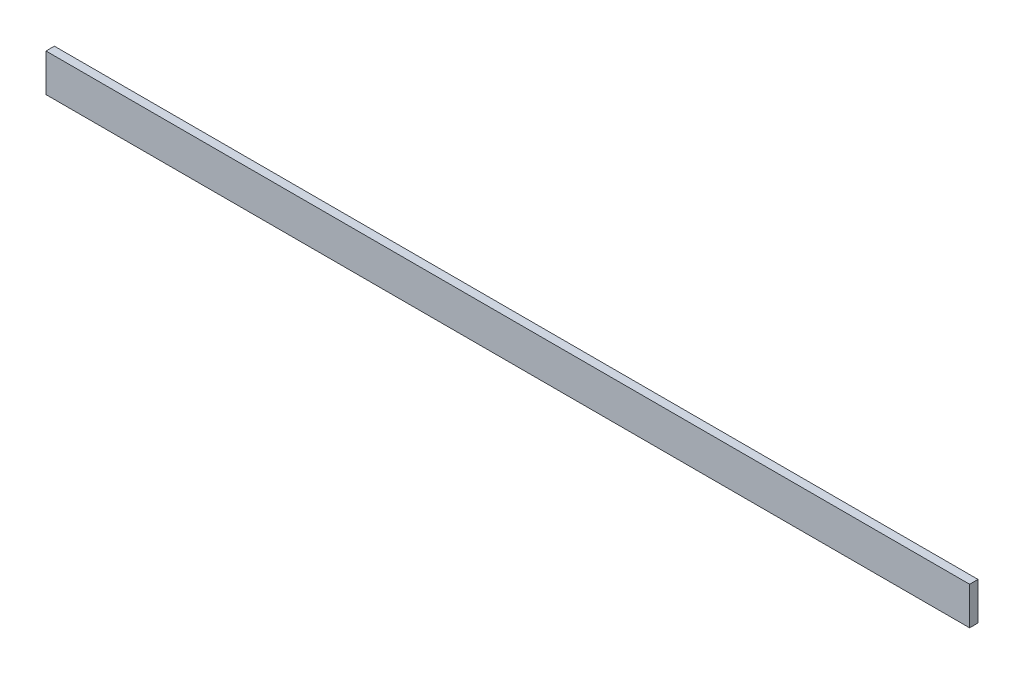
ISO-10303-21;
HEADER;
FILE_DESCRIPTION(('STEP AP214'),'2;1');
FILE_NAME('part.step','',(''),(''),'','','');
FILE_SCHEMA(('AUTOMOTIVE_DESIGN { 1 0 10303 214 1 1 1 1 }'));
ENDSEC;
DATA;
#1=APPLICATION_CONTEXT('core data for automotive mechanical design processes');
#2=APPLICATION_PROTOCOL_DEFINITION('international standard','automotive_design',2000,#1);
#3=PRODUCT_CONTEXT('',#1,'mechanical');
#4=PRODUCT('Part','Part','',(#3));
#5=PRODUCT_RELATED_PRODUCT_CATEGORY('part','',(#4));
#6=PRODUCT_DEFINITION_FORMATION('','',#4);
#7=PRODUCT_DEFINITION_CONTEXT('part definition',#1,'design');
#8=PRODUCT_DEFINITION('design','',#6,#7);
#9=PRODUCT_DEFINITION_SHAPE('','',#8);
#10=(LENGTH_UNIT() NAMED_UNIT(*) SI_UNIT(.MILLI.,.METRE.));
#11=(NAMED_UNIT(*) PLANE_ANGLE_UNIT() SI_UNIT($,.RADIAN.));
#12=(NAMED_UNIT(*) SI_UNIT($,.STERADIAN.) SOLID_ANGLE_UNIT());
#13=UNCERTAINTY_MEASURE_WITH_UNIT(LENGTH_MEASURE(1.E-05),#10,'distance_accuracy_value','');
#14=(GEOMETRIC_REPRESENTATION_CONTEXT(3) GLOBAL_UNCERTAINTY_ASSIGNED_CONTEXT((#13)) GLOBAL_UNIT_ASSIGNED_CONTEXT((#10,
#11,#12)) REPRESENTATION_CONTEXT('',''));
#15=CARTESIAN_POINT('',(0.,0.,0.));
#16=DIRECTION('',(0.,0.,1.));
#17=DIRECTION('',(1.,0.,0.));
#18=AXIS2_PLACEMENT_3D('',#15,#16,#17);
#19=CARTESIAN_POINT('',(-123.621120621464,34.7998479798228,20.));
#20=DIRECTION('',(1.,0.,0.));
#21=DIRECTION('',(0.,1.,0.));
#22=AXIS2_PLACEMENT_3D('',#19,#20,#21);
#23=PLANE('',#22);
#24=DIRECTION('',(0.,-1.,0.));
#25=VECTOR('',#24,1.);
#26=CARTESIAN_POINT('',(-123.621120621464,34.7998479798228,0.));
#27=LINE('',#26,#25);
#28=CARTESIAN_POINT('',(-123.621120621464,34.7998479798228,0.));
#29=VERTEX_POINT('',#28);
#30=CARTESIAN_POINT('',(-123.621120621464,-55.2001520201772,0.));
#31=VERTEX_POINT('',#30);
#32=EDGE_CURVE('E95',#29,#31,#27,.T.);
#33=ORIENTED_EDGE('',*,*,#32,.T.);
#34=DIRECTION('',(0.,0.,-1.));
#35=VECTOR('',#34,1.);
#36=CARTESIAN_POINT('',(-123.621120621464,-55.2001520201772,20.));
#37=LINE('',#36,#35);
#38=CARTESIAN_POINT('',(-123.621120621464,-55.2001520201772,20.));
#39=VERTEX_POINT('',#38);
#40=EDGE_CURVE('E11',#39,#31,#37,.T.);
#41=ORIENTED_EDGE('',*,*,#40,.F.);
#42=DIRECTION('',(0.,-1.,0.));
#43=VECTOR('',#42,1.);
#44=CARTESIAN_POINT('',(-123.621120621464,34.7998479798228,20.));
#45=LINE('',#44,#43);
#46=CARTESIAN_POINT('',(-123.621120621464,34.7998479798228,20.));
#47=VERTEX_POINT('',#46);
#48=EDGE_CURVE('E83',#47,#39,#45,.T.);
#49=ORIENTED_EDGE('',*,*,#48,.F.);
#50=DIRECTION('',(0.,0.,-1.));
#51=VECTOR('',#50,1.);
#52=CARTESIAN_POINT('',(-123.621120621464,34.7998479798228,20.));
#53=LINE('',#52,#51);
#54=EDGE_CURVE('E91',#47,#29,#53,.T.);
#55=ORIENTED_EDGE('',*,*,#54,.T.);
#56=EDGE_LOOP('',(#33,#41,#49,#55));
#57=FACE_BOUND('',#56,.T.);
#58=ADVANCED_FACE('F32',(#57),#23,.F.);
#59=CARTESIAN_POINT('',(-123.621120621464,-55.2001520201772,20.));
#60=DIRECTION('',(0.,1.,0.));
#61=DIRECTION('',(0.,0.,1.));
#62=AXIS2_PLACEMENT_3D('',#59,#60,#61);
#63=PLANE('',#62);
#64=DIRECTION('',(1.,0.,0.));
#65=VECTOR('',#64,1.);
#66=CARTESIAN_POINT('',(-123.621120621464,-55.2001520201772,0.));
#67=LINE('',#66,#65);
#68=CARTESIAN_POINT('',(2076.37887937854,-55.2001520201772,0.));
#69=VERTEX_POINT('',#68);
#70=EDGE_CURVE('E87',#31,#69,#67,.T.);
#71=ORIENTED_EDGE('',*,*,#70,.T.);
#72=DIRECTION('',(0.,0.,-1.));
#73=VECTOR('',#72,1.);
#74=CARTESIAN_POINT('',(2076.37887937854,-55.2001520201772,20.));
#75=LINE('',#74,#73);
#76=CARTESIAN_POINT('',(2076.37887937854,-55.2001520201772,20.));
#77=VERTEX_POINT('',#76);
#78=EDGE_CURVE('E40',#77,#69,#75,.T.);
#79=ORIENTED_EDGE('',*,*,#78,.F.);
#80=DIRECTION('',(1.,0.,0.));
#81=VECTOR('',#80,1.);
#82=CARTESIAN_POINT('',(-123.621120621464,-55.2001520201772,20.));
#83=LINE('',#82,#81);
#84=EDGE_CURVE('E78',#39,#77,#83,.T.);
#85=ORIENTED_EDGE('',*,*,#84,.F.);
#86=ORIENTED_EDGE('',*,*,#40,.T.);
#87=EDGE_LOOP('',(#71,#79,#85,#86));
#88=FACE_BOUND('',#87,.T.);
#89=ADVANCED_FACE('F86',(#88),#63,.F.);
#90=CARTESIAN_POINT('',(2076.37887937854,34.7998479798228,20.));
#91=DIRECTION('',(-1.,0.,0.));
#92=DIRECTION('',(0.,0.,1.));
#93=AXIS2_PLACEMENT_3D('',#90,#91,#92);
#94=PLANE('',#93);
#95=DIRECTION('',(0.,1.,0.));
#96=VECTOR('',#95,1.);
#97=CARTESIAN_POINT('',(2076.37887937854,34.7998479798228,0.));
#98=LINE('',#97,#96);
#99=CARTESIAN_POINT('',(2076.37887937854,34.7998479798228,0.));
#100=VERTEX_POINT('',#99);
#101=EDGE_CURVE('E65',#69,#100,#98,.T.);
#102=ORIENTED_EDGE('',*,*,#101,.T.);
#103=DIRECTION('',(0.,0.,-1.));
#104=VECTOR('',#103,1.);
#105=CARTESIAN_POINT('',(2076.37887937854,34.7998479798228,20.));
#106=LINE('',#105,#104);
#107=CARTESIAN_POINT('',(2076.37887937854,34.7998479798228,20.));
#108=VERTEX_POINT('',#107);
#109=EDGE_CURVE('E88',#108,#100,#106,.T.);
#110=ORIENTED_EDGE('',*,*,#109,.F.);
#111=DIRECTION('',(0.,1.,0.));
#112=VECTOR('',#111,1.);
#113=CARTESIAN_POINT('',(2076.37887937854,34.7998479798228,20.));
#114=LINE('',#113,#112);
#115=EDGE_CURVE('E81',#77,#108,#114,.T.);
#116=ORIENTED_EDGE('',*,*,#115,.F.);
#117=ORIENTED_EDGE('',*,*,#78,.T.);
#118=EDGE_LOOP('',(#102,#110,#116,#117));
#119=FACE_BOUND('',#118,.T.);
#120=ADVANCED_FACE('F89',(#119),#94,.F.);
#121=CARTESIAN_POINT('',(-123.621120621464,34.7998479798228,20.));
#122=DIRECTION('',(0.,-1.,0.));
#123=DIRECTION('',(0.,0.,-1.));
#124=AXIS2_PLACEMENT_3D('',#121,#122,#123);
#125=PLANE('',#124);
#126=DIRECTION('',(-1.,0.,0.));
#127=VECTOR('',#126,1.);
#128=CARTESIAN_POINT('',(-123.621120621464,34.7998479798228,0.));
#129=LINE('',#128,#127);
#130=EDGE_CURVE('E71',#100,#29,#129,.T.);
#131=ORIENTED_EDGE('',*,*,#130,.T.);
#132=ORIENTED_EDGE('',*,*,#54,.F.);
#133=DIRECTION('',(-1.,0.,0.));
#134=VECTOR('',#133,1.);
#135=CARTESIAN_POINT('',(-123.621120621464,34.7998479798228,20.));
#136=LINE('',#135,#134);
#137=EDGE_CURVE('E48',#108,#47,#136,.T.);
#138=ORIENTED_EDGE('',*,*,#137,.F.);
#139=ORIENTED_EDGE('',*,*,#109,.T.);
#140=EDGE_LOOP('',(#131,#132,#138,#139));
#141=FACE_BOUND('',#140,.T.);
#142=ADVANCED_FACE('F102',(#141),#125,.F.);
#143=CARTESIAN_POINT('',(0.,0.,20.));
#144=DIRECTION('',(0.,0.,1.));
#145=DIRECTION('',(1.,0.,0.));
#146=AXIS2_PLACEMENT_3D('',#143,#144,#145);
#147=PLANE('',#146);
#148=ORIENTED_EDGE('',*,*,#48,.T.);
#149=ORIENTED_EDGE('',*,*,#84,.T.);
#150=ORIENTED_EDGE('',*,*,#115,.T.);
#151=ORIENTED_EDGE('',*,*,#137,.T.);
#152=EDGE_LOOP('',(#148,#149,#150,#151));
#153=FACE_BOUND('',#152,.T.);
#154=ADVANCED_FACE('F79',(#153),#147,.T.);
#155=CARTESIAN_POINT('',(0.,0.,0.));
#156=DIRECTION('',(0.,0.,1.));
#157=DIRECTION('',(1.,0.,0.));
#158=AXIS2_PLACEMENT_3D('',#155,#156,#157);
#159=PLANE('',#158);
#160=ORIENTED_EDGE('',*,*,#32,.F.);
#161=ORIENTED_EDGE('',*,*,#130,.F.);
#162=ORIENTED_EDGE('',*,*,#101,.F.);
#163=ORIENTED_EDGE('',*,*,#70,.F.);
#164=EDGE_LOOP('',(#160,#161,#162,#163));
#165=FACE_BOUND('',#164,.T.);
#166=ADVANCED_FACE('F105',(#165),#159,.F.);
#167=CLOSED_SHELL('',(#58,#89,#120,#142,#154,#166));
#168=MANIFOLD_SOLID_BREP('B2',#167);
#169=ADVANCED_BREP_SHAPE_REPRESENTATION('',(#18,#168),#14);
#170=SHAPE_DEFINITION_REPRESENTATION(#9,#169);
ENDSEC;
END-ISO-10303-21;
